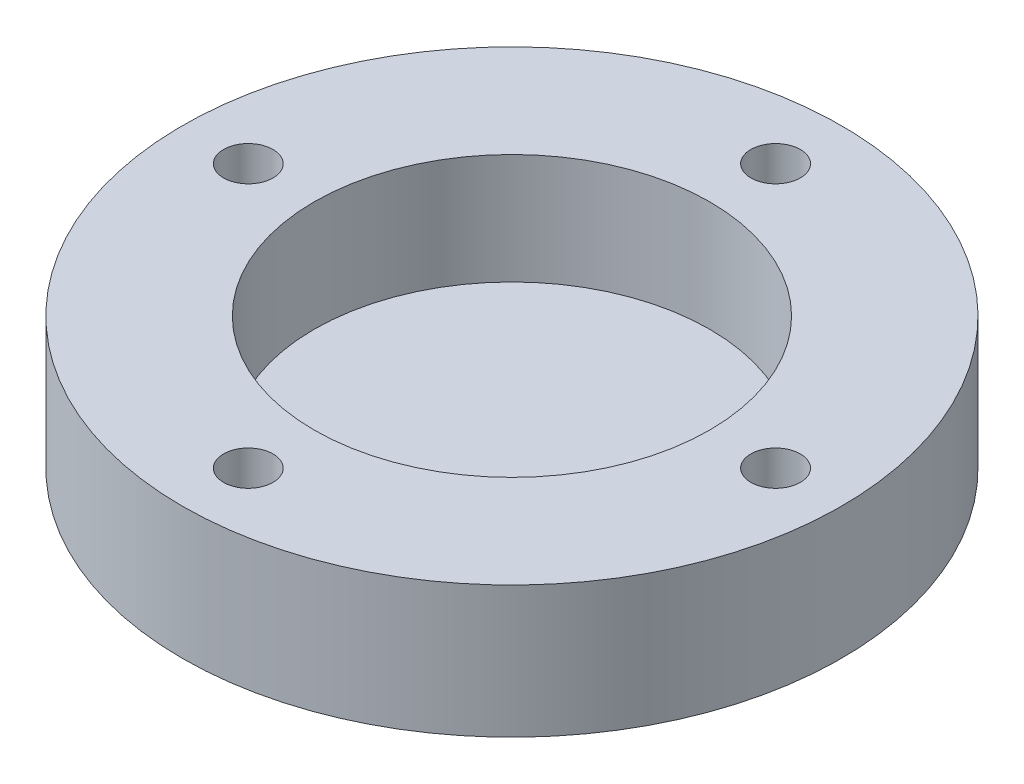
ISO-10303-21;
HEADER;
FILE_DESCRIPTION(('STEP AP214'),'2;1');
FILE_NAME('part.step','',(''),(''),'','','');
FILE_SCHEMA(('AUTOMOTIVE_DESIGN { 1 0 10303 214 1 1 1 1 }'));
ENDSEC;
DATA;
#1=APPLICATION_CONTEXT('core data for automotive mechanical design processes');
#2=APPLICATION_PROTOCOL_DEFINITION('international standard','automotive_design',2000,#1);
#3=PRODUCT_CONTEXT('',#1,'mechanical');
#4=PRODUCT('Part','Part','',(#3));
#5=PRODUCT_RELATED_PRODUCT_CATEGORY('part','',(#4));
#6=PRODUCT_DEFINITION_FORMATION('','',#4);
#7=PRODUCT_DEFINITION_CONTEXT('part definition',#1,'design');
#8=PRODUCT_DEFINITION('design','',#6,#7);
#9=PRODUCT_DEFINITION_SHAPE('','',#8);
#10=(LENGTH_UNIT() NAMED_UNIT(*) SI_UNIT(.MILLI.,.METRE.));
#11=(NAMED_UNIT(*) PLANE_ANGLE_UNIT() SI_UNIT($,.RADIAN.));
#12=(NAMED_UNIT(*) SI_UNIT($,.STERADIAN.) SOLID_ANGLE_UNIT());
#13=UNCERTAINTY_MEASURE_WITH_UNIT(LENGTH_MEASURE(1.E-05),#10,'distance_accuracy_value','');
#14=(GEOMETRIC_REPRESENTATION_CONTEXT(3) GLOBAL_UNCERTAINTY_ASSIGNED_CONTEXT((#13)) GLOBAL_UNIT_ASSIGNED_CONTEXT((#10,
#11,#12)) REPRESENTATION_CONTEXT('',''));
#15=CARTESIAN_POINT('',(0.,0.,0.));
#16=DIRECTION('',(0.,0.,1.));
#17=DIRECTION('',(1.,0.,0.));
#18=AXIS2_PLACEMENT_3D('',#15,#16,#17);
#19=CARTESIAN_POINT('',(0.,8.,0.));
#20=DIRECTION('',(0.,-1.,0.));
#21=DIRECTION('',(0.,0.,-1.));
#22=AXIS2_PLACEMENT_3D('',#19,#20,#21);
#23=CYLINDRICAL_SURFACE('',#22,20.);
#24=CARTESIAN_POINT('',(0.,8.,0.));
#25=DIRECTION('',(0.,1.,0.));
#26=DIRECTION('',(0.,0.,1.));
#27=AXIS2_PLACEMENT_3D('',#24,#25,#26);
#28=CIRCLE('',#27,20.);
#29=CARTESIAN_POINT('',(0.,8.,20.));
#30=VERTEX_POINT('',#29);
#31=EDGE_CURVE('E10',#30,#30,#28,.T.);
#32=ORIENTED_EDGE('',*,*,#31,.F.);
#33=EDGE_LOOP('',(#32));
#34=FACE_BOUND('',#33,.T.);
#35=CARTESIAN_POINT('',(0.,0.,0.));
#36=DIRECTION('',(0.,1.,0.));
#37=DIRECTION('',(0.,0.,1.));
#38=AXIS2_PLACEMENT_3D('',#35,#36,#37);
#39=CIRCLE('',#38,20.);
#40=CARTESIAN_POINT('',(0.,0.,20.));
#41=VERTEX_POINT('',#40);
#42=EDGE_CURVE('E35',#41,#41,#39,.T.);
#43=ORIENTED_EDGE('',*,*,#42,.T.);
#44=EDGE_LOOP('',(#43));
#45=FACE_BOUND('',#44,.T.);
#46=ADVANCED_FACE('F32',(#34,#45),#23,.T.);
#47=CARTESIAN_POINT('',(0.,8.,0.));
#48=DIRECTION('',(0.,1.,0.));
#49=DIRECTION('',(0.,0.,1.));
#50=AXIS2_PLACEMENT_3D('',#47,#48,#49);
#51=PLANE('',#50);
#52=CARTESIAN_POINT('',(0.,8.,0.));
#53=DIRECTION('',(0.,-1.,0.));
#54=DIRECTION('',(0.,0.,-1.));
#55=AXIS2_PLACEMENT_3D('',#52,#53,#54);
#56=CIRCLE('',#55,12.);
#57=CARTESIAN_POINT('',(0.,8.,-12.));
#58=VERTEX_POINT('',#57);
#59=EDGE_CURVE('E68',#58,#58,#56,.T.);
#60=ORIENTED_EDGE('',*,*,#59,.T.);
#61=EDGE_LOOP('',(#60));
#62=FACE_BOUND('',#61,.T.);
#63=CARTESIAN_POINT('',(0.,8.,-16.));
#64=DIRECTION('',(0.,1.,0.));
#65=DIRECTION('',(0.,0.,1.));
#66=AXIS2_PLACEMENT_3D('',#63,#64,#65);
#67=CIRCLE('',#66,1.5);
#68=CARTESIAN_POINT('',(0.,8.,-14.5));
#69=VERTEX_POINT('',#68);
#70=EDGE_CURVE('E63',#69,#69,#67,.T.);
#71=ORIENTED_EDGE('',*,*,#70,.F.);
#72=EDGE_LOOP('',(#71));
#73=FACE_BOUND('',#72,.T.);
#74=CARTESIAN_POINT('',(-16.,8.,0.));
#75=DIRECTION('',(0.,1.,0.));
#76=DIRECTION('',(0.,0.,1.));
#77=AXIS2_PLACEMENT_3D('',#74,#75,#76);
#78=CIRCLE('',#77,1.5);
#79=CARTESIAN_POINT('',(-16.,8.,1.5));
#80=VERTEX_POINT('',#79);
#81=EDGE_CURVE('E57',#80,#80,#78,.T.);
#82=ORIENTED_EDGE('',*,*,#81,.F.);
#83=EDGE_LOOP('',(#82));
#84=FACE_BOUND('',#83,.T.);
#85=CARTESIAN_POINT('',(16.,8.,0.));
#86=DIRECTION('',(0.,1.,0.));
#87=DIRECTION('',(0.,0.,1.));
#88=AXIS2_PLACEMENT_3D('',#85,#86,#87);
#89=CIRCLE('',#88,1.5);
#90=CARTESIAN_POINT('',(16.,8.,1.5));
#91=VERTEX_POINT('',#90);
#92=EDGE_CURVE('E51',#91,#91,#89,.T.);
#93=ORIENTED_EDGE('',*,*,#92,.F.);
#94=EDGE_LOOP('',(#93));
#95=FACE_BOUND('',#94,.T.);
#96=CARTESIAN_POINT('',(0.,8.,16.));
#97=DIRECTION('',(0.,1.,0.));
#98=DIRECTION('',(0.,0.,1.));
#99=AXIS2_PLACEMENT_3D('',#96,#97,#98);
#100=CIRCLE('',#99,1.5);
#101=CARTESIAN_POINT('',(0.,8.,17.5));
#102=VERTEX_POINT('',#101);
#103=EDGE_CURVE('E44',#102,#102,#100,.T.);
#104=ORIENTED_EDGE('',*,*,#103,.F.);
#105=EDGE_LOOP('',(#104));
#106=FACE_BOUND('',#105,.T.);
#107=ORIENTED_EDGE('',*,*,#31,.T.);
#108=EDGE_LOOP('',(#107));
#109=FACE_BOUND('',#108,.T.);
#110=ADVANCED_FACE('F86',(#62,#73,#84,#95,#106,#109),#51,.T.);
#111=CARTESIAN_POINT('',(0.,0.,0.));
#112=DIRECTION('',(0.,1.,0.));
#113=DIRECTION('',(0.,0.,1.));
#114=AXIS2_PLACEMENT_3D('',#111,#112,#113);
#115=PLANE('',#114);
#116=CARTESIAN_POINT('',(0.,0.,-16.));
#117=DIRECTION('',(0.,1.,0.));
#118=DIRECTION('',(0.,0.,1.));
#119=AXIS2_PLACEMENT_3D('',#116,#117,#118);
#120=CIRCLE('',#119,1.5);
#121=CARTESIAN_POINT('',(0.,0.,-14.5));
#122=VERTEX_POINT('',#121);
#123=EDGE_CURVE('E42',#122,#122,#120,.T.);
#124=ORIENTED_EDGE('',*,*,#123,.T.);
#125=EDGE_LOOP('',(#124));
#126=FACE_BOUND('',#125,.T.);
#127=CARTESIAN_POINT('',(-16.,0.,0.));
#128=DIRECTION('',(0.,1.,0.));
#129=DIRECTION('',(0.,0.,1.));
#130=AXIS2_PLACEMENT_3D('',#127,#128,#129);
#131=CIRCLE('',#130,1.5);
#132=CARTESIAN_POINT('',(-16.,0.,1.5));
#133=VERTEX_POINT('',#132);
#134=EDGE_CURVE('E60',#133,#133,#131,.T.);
#135=ORIENTED_EDGE('',*,*,#134,.T.);
#136=EDGE_LOOP('',(#135));
#137=FACE_BOUND('',#136,.T.);
#138=CARTESIAN_POINT('',(16.,0.,0.));
#139=DIRECTION('',(0.,1.,0.));
#140=DIRECTION('',(0.,0.,1.));
#141=AXIS2_PLACEMENT_3D('',#138,#139,#140);
#142=CIRCLE('',#141,1.5);
#143=CARTESIAN_POINT('',(16.,0.,1.5));
#144=VERTEX_POINT('',#143);
#145=EDGE_CURVE('E54',#144,#144,#142,.T.);
#146=ORIENTED_EDGE('',*,*,#145,.T.);
#147=EDGE_LOOP('',(#146));
#148=FACE_BOUND('',#147,.T.);
#149=CARTESIAN_POINT('',(0.,0.,16.));
#150=DIRECTION('',(0.,1.,0.));
#151=DIRECTION('',(0.,0.,1.));
#152=AXIS2_PLACEMENT_3D('',#149,#150,#151);
#153=CIRCLE('',#152,1.5);
#154=CARTESIAN_POINT('',(0.,0.,17.5));
#155=VERTEX_POINT('',#154);
#156=EDGE_CURVE('E47',#155,#155,#153,.T.);
#157=ORIENTED_EDGE('',*,*,#156,.T.);
#158=EDGE_LOOP('',(#157));
#159=FACE_BOUND('',#158,.T.);
#160=ORIENTED_EDGE('',*,*,#42,.F.);
#161=EDGE_LOOP('',(#160));
#162=FACE_BOUND('',#161,.T.);
#163=ADVANCED_FACE('F91',(#126,#137,#148,#159,#162),#115,.F.);
#164=CARTESIAN_POINT('',(0.,0.,16.));
#165=DIRECTION('',(0.,1.,0.));
#166=DIRECTION('',(0.,0.,1.));
#167=AXIS2_PLACEMENT_3D('',#164,#165,#166);
#168=CYLINDRICAL_SURFACE('',#167,1.5);
#169=ORIENTED_EDGE('',*,*,#156,.F.);
#170=EDGE_LOOP('',(#169));
#171=FACE_BOUND('',#170,.T.);
#172=ORIENTED_EDGE('',*,*,#103,.T.);
#173=EDGE_LOOP('',(#172));
#174=FACE_BOUND('',#173,.T.);
#175=ADVANCED_FACE('F98',(#171,#174),#168,.F.);
#176=CARTESIAN_POINT('',(16.,0.,0.));
#177=DIRECTION('',(0.,1.,0.));
#178=DIRECTION('',(0.,0.,1.));
#179=AXIS2_PLACEMENT_3D('',#176,#177,#178);
#180=CYLINDRICAL_SURFACE('',#179,1.5);
#181=ORIENTED_EDGE('',*,*,#145,.F.);
#182=EDGE_LOOP('',(#181));
#183=FACE_BOUND('',#182,.T.);
#184=ORIENTED_EDGE('',*,*,#92,.T.);
#185=EDGE_LOOP('',(#184));
#186=FACE_BOUND('',#185,.T.);
#187=ADVANCED_FACE('F103',(#183,#186),#180,.F.);
#188=CARTESIAN_POINT('',(-16.,0.,0.));
#189=DIRECTION('',(0.,1.,0.));
#190=DIRECTION('',(0.,0.,1.));
#191=AXIS2_PLACEMENT_3D('',#188,#189,#190);
#192=CYLINDRICAL_SURFACE('',#191,1.5);
#193=ORIENTED_EDGE('',*,*,#134,.F.);
#194=EDGE_LOOP('',(#193));
#195=FACE_BOUND('',#194,.T.);
#196=ORIENTED_EDGE('',*,*,#81,.T.);
#197=EDGE_LOOP('',(#196));
#198=FACE_BOUND('',#197,.T.);
#199=ADVANCED_FACE('F110',(#195,#198),#192,.F.);
#200=CARTESIAN_POINT('',(0.,0.,-16.));
#201=DIRECTION('',(0.,1.,0.));
#202=DIRECTION('',(0.,0.,1.));
#203=AXIS2_PLACEMENT_3D('',#200,#201,#202);
#204=CYLINDRICAL_SURFACE('',#203,1.5);
#205=ORIENTED_EDGE('',*,*,#123,.F.);
#206=EDGE_LOOP('',(#205));
#207=FACE_BOUND('',#206,.T.);
#208=ORIENTED_EDGE('',*,*,#70,.T.);
#209=EDGE_LOOP('',(#208));
#210=FACE_BOUND('',#209,.T.);
#211=ADVANCED_FACE('F83',(#207,#210),#204,.F.);
#212=CARTESIAN_POINT('',(0.,1.3,0.));
#213=DIRECTION('',(0.,1.,0.));
#214=DIRECTION('',(0.,0.,1.));
#215=AXIS2_PLACEMENT_3D('',#212,#213,#214);
#216=CYLINDRICAL_SURFACE('',#215,12.);
#217=CARTESIAN_POINT('',(0.,1.3,0.));
#218=DIRECTION('',(0.,-1.,0.));
#219=DIRECTION('',(0.,0.,-1.));
#220=AXIS2_PLACEMENT_3D('',#217,#218,#219);
#221=CIRCLE('',#220,12.);
#222=CARTESIAN_POINT('',(0.,1.3,-12.));
#223=VERTEX_POINT('',#222);
#224=EDGE_CURVE('E48',#223,#223,#221,.T.);
#225=ORIENTED_EDGE('',*,*,#224,.T.);
#226=EDGE_LOOP('',(#225));
#227=FACE_BOUND('',#226,.T.);
#228=ORIENTED_EDGE('',*,*,#59,.F.);
#229=EDGE_LOOP('',(#228));
#230=FACE_BOUND('',#229,.T.);
#231=ADVANCED_FACE('F74',(#227,#230),#216,.F.);
#232=CARTESIAN_POINT('',(0.,1.3,0.));
#233=DIRECTION('',(0.,-1.,0.));
#234=DIRECTION('',(0.,0.,-1.));
#235=AXIS2_PLACEMENT_3D('',#232,#233,#234);
#236=PLANE('',#235);
#237=ORIENTED_EDGE('',*,*,#224,.F.);
#238=EDGE_LOOP('',(#237));
#239=FACE_BOUND('',#238,.T.);
#240=ADVANCED_FACE('F77',(#239),#236,.F.);
#241=CLOSED_SHELL('',(#46,#110,#163,#175,#187,#199,#211,#231,#240));
#242=MANIFOLD_SOLID_BREP('B2',#241);
#243=ADVANCED_BREP_SHAPE_REPRESENTATION('',(#18,#242),#14);
#244=SHAPE_DEFINITION_REPRESENTATION(#9,#243);
ENDSEC;
END-ISO-10303-21;
